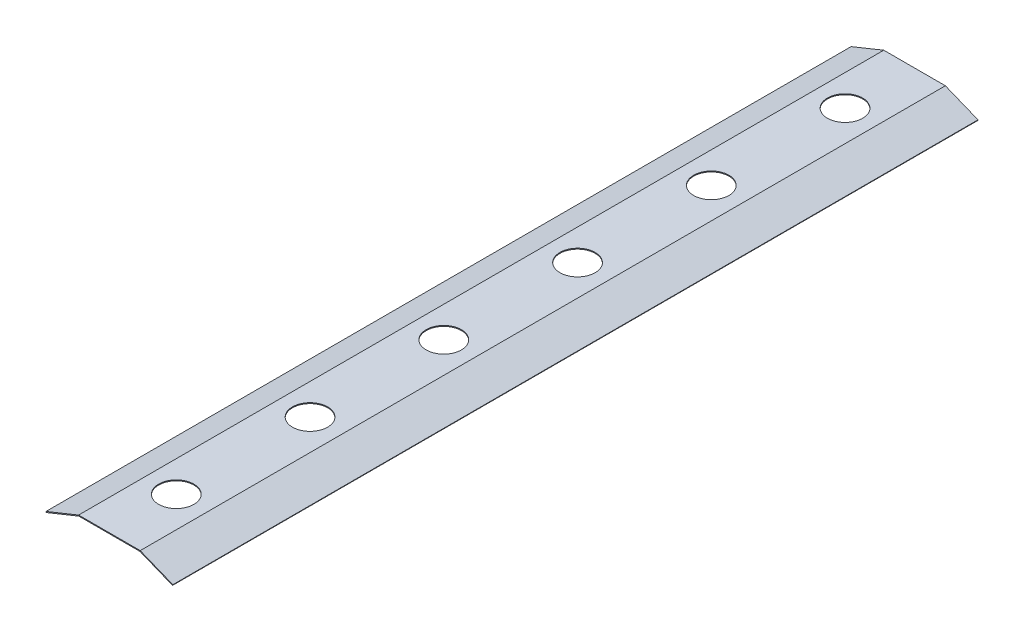
ISO-10303-21;
HEADER;
FILE_DESCRIPTION(('STEP AP214'),'2;1');
FILE_NAME('part.step','',(''),(''),'','','');
FILE_SCHEMA(('AUTOMOTIVE_DESIGN { 1 0 10303 214 1 1 1 1 }'));
ENDSEC;
DATA;
#1=APPLICATION_CONTEXT('core data for automotive mechanical design processes');
#2=APPLICATION_PROTOCOL_DEFINITION('international standard','automotive_design',2000,#1);
#3=PRODUCT_CONTEXT('',#1,'mechanical');
#4=PRODUCT('Part','Part','',(#3));
#5=PRODUCT_RELATED_PRODUCT_CATEGORY('part','',(#4));
#6=PRODUCT_DEFINITION_FORMATION('','',#4);
#7=PRODUCT_DEFINITION_CONTEXT('part definition',#1,'design');
#8=PRODUCT_DEFINITION('design','',#6,#7);
#9=PRODUCT_DEFINITION_SHAPE('','',#8);
#10=(LENGTH_UNIT() NAMED_UNIT(*) SI_UNIT(.MILLI.,.METRE.));
#11=(NAMED_UNIT(*) PLANE_ANGLE_UNIT() SI_UNIT($,.RADIAN.));
#12=(NAMED_UNIT(*) SI_UNIT($,.STERADIAN.) SOLID_ANGLE_UNIT());
#13=UNCERTAINTY_MEASURE_WITH_UNIT(LENGTH_MEASURE(1.E-05),#10,'distance_accuracy_value','');
#14=(GEOMETRIC_REPRESENTATION_CONTEXT(3) GLOBAL_UNCERTAINTY_ASSIGNED_CONTEXT((#13)) GLOBAL_UNIT_ASSIGNED_CONTEXT((#10,
#11,#12)) REPRESENTATION_CONTEXT('',''));
#15=CARTESIAN_POINT('',(0.,0.,0.));
#16=DIRECTION('',(0.,0.,1.));
#17=DIRECTION('',(1.,0.,0.));
#18=AXIS2_PLACEMENT_3D('',#15,#16,#17);
#19=CARTESIAN_POINT('',(-34.8056196908623,-1.,-915.));
#20=DIRECTION('',(0.,-1.,0.));
#21=DIRECTION('',(0.,0.,-1.));
#22=AXIS2_PLACEMENT_3D('',#19,#20,#21);
#23=PLANE('',#22);
#24=CARTESIAN_POINT('',(0.,-1.,-76.));
#25=DIRECTION('',(0.,-1.,0.));
#26=DIRECTION('',(0.,0.,-1.));
#27=AXIS2_PLACEMENT_3D('',#24,#25,#26);
#28=CIRCLE('',#27,20.);
#29=CARTESIAN_POINT('',(0.,-1.,-96.));
#30=VERTEX_POINT('',#29);
#31=EDGE_CURVE('E134',#30,#30,#28,.T.);
#32=ORIENTED_EDGE('',*,*,#31,.F.);
#33=EDGE_LOOP('',(#32));
#34=FACE_BOUND('',#33,.T.);
#35=CARTESIAN_POINT('',(0.,-1.,-228.));
#36=DIRECTION('',(0.,-1.,0.));
#37=DIRECTION('',(0.,0.,-1.));
#38=AXIS2_PLACEMENT_3D('',#35,#36,#37);
#39=CIRCLE('',#38,20.);
#40=CARTESIAN_POINT('',(0.,-1.,-248.));
#41=VERTEX_POINT('',#40);
#42=EDGE_CURVE('E256',#41,#41,#39,.T.);
#43=ORIENTED_EDGE('',*,*,#42,.F.);
#44=EDGE_LOOP('',(#43));
#45=FACE_BOUND('',#44,.T.);
#46=CARTESIAN_POINT('',(0.,-1.,-380.));
#47=DIRECTION('',(0.,-1.,0.));
#48=DIRECTION('',(0.,0.,-1.));
#49=AXIS2_PLACEMENT_3D('',#46,#47,#48);
#50=CIRCLE('',#49,20.);
#51=CARTESIAN_POINT('',(0.,-1.,-400.));
#52=VERTEX_POINT('',#51);
#53=EDGE_CURVE('E253',#52,#52,#50,.T.);
#54=ORIENTED_EDGE('',*,*,#53,.F.);
#55=EDGE_LOOP('',(#54));
#56=FACE_BOUND('',#55,.T.);
#57=CARTESIAN_POINT('',(0.,-1.,-532.));
#58=DIRECTION('',(0.,-1.,0.));
#59=DIRECTION('',(0.,0.,-1.));
#60=AXIS2_PLACEMENT_3D('',#57,#58,#59);
#61=CIRCLE('',#60,20.);
#62=CARTESIAN_POINT('',(0.,-1.,-552.));
#63=VERTEX_POINT('',#62);
#64=EDGE_CURVE('E250',#63,#63,#61,.T.);
#65=ORIENTED_EDGE('',*,*,#64,.F.);
#66=EDGE_LOOP('',(#65));
#67=FACE_BOUND('',#66,.T.);
#68=CARTESIAN_POINT('',(0.,-1.,-684.));
#69=DIRECTION('',(0.,-1.,0.));
#70=DIRECTION('',(0.,0.,-1.));
#71=AXIS2_PLACEMENT_3D('',#68,#69,#70);
#72=CIRCLE('',#71,20.);
#73=CARTESIAN_POINT('',(0.,-1.,-704.));
#74=VERTEX_POINT('',#73);
#75=EDGE_CURVE('E231',#74,#74,#72,.T.);
#76=ORIENTED_EDGE('',*,*,#75,.F.);
#77=EDGE_LOOP('',(#76));
#78=FACE_BOUND('',#77,.T.);
#79=CARTESIAN_POINT('',(0.,-1.,-836.));
#80=DIRECTION('',(0.,-1.,0.));
#81=DIRECTION('',(0.,0.,-1.));
#82=AXIS2_PLACEMENT_3D('',#79,#80,#81);
#83=CIRCLE('',#82,20.);
#84=CARTESIAN_POINT('',(0.,-1.,-856.));
#85=VERTEX_POINT('',#84);
#86=EDGE_CURVE('E227',#85,#85,#83,.T.);
#87=ORIENTED_EDGE('',*,*,#86,.F.);
#88=EDGE_LOOP('',(#87));
#89=FACE_BOUND('',#88,.T.);
#90=DIRECTION('',(1.,0.,0.));
#91=VECTOR('',#90,1.);
#92=CARTESIAN_POINT('',(-34.8056196908623,-1.,0.));
#93=LINE('',#92,#91);
#94=CARTESIAN_POINT('',(-34.8056196908623,-1.,0.));
#95=VERTEX_POINT('',#94);
#96=CARTESIAN_POINT('',(34.8056196908623,-1.,0.));
#97=VERTEX_POINT('',#96);
#98=EDGE_CURVE('E130',#95,#97,#93,.T.);
#99=ORIENTED_EDGE('',*,*,#98,.F.);
#100=DIRECTION('',(0.,0.,1.));
#101=VECTOR('',#100,1.);
#102=CARTESIAN_POINT('',(-34.8056196908623,-1.,-915.));
#103=LINE('',#102,#101);
#104=CARTESIAN_POINT('',(-34.8056196908623,-1.,-915.));
#105=VERTEX_POINT('',#104);
#106=EDGE_CURVE('E11',#105,#95,#103,.T.);
#107=ORIENTED_EDGE('',*,*,#106,.F.);
#108=DIRECTION('',(1.,0.,0.));
#109=VECTOR('',#108,1.);
#110=CARTESIAN_POINT('',(-34.8056196908623,-1.,-915.));
#111=LINE('',#110,#109);
#112=CARTESIAN_POINT('',(34.8056196908623,-1.,-915.));
#113=VERTEX_POINT('',#112);
#114=EDGE_CURVE('E151',#105,#113,#111,.T.);
#115=ORIENTED_EDGE('',*,*,#114,.T.);
#116=DIRECTION('',(0.,0.,1.));
#117=VECTOR('',#116,1.);
#118=CARTESIAN_POINT('',(34.8056196908623,-1.,-915.));
#119=LINE('',#118,#117);
#120=EDGE_CURVE('E36',#113,#97,#119,.T.);
#121=ORIENTED_EDGE('',*,*,#120,.T.);
#122=EDGE_LOOP('',(#99,#107,#115,#121));
#123=FACE_BOUND('',#122,.T.);
#124=ADVANCED_FACE('F33',(#34,#45,#56,#67,#78,#89,#123),#23,.T.);
#125=CARTESIAN_POINT('',(-34.8056196908623,-1.,-915.));
#126=DIRECTION('',(0.374606593415907,-0.92718385456679,0.));
#127=DIRECTION('',(0.92718385456679,0.374606593415907,0.));
#128=AXIS2_PLACEMENT_3D('',#125,#126,#127);
#129=PLANE('',#128);
#130=DIRECTION('',(0.92718385456679,0.374606593415907,0.));
#131=VECTOR('',#130,1.);
#132=CARTESIAN_POINT('',(-34.8056196908623,-1.,0.));
#133=LINE('',#132,#131);
#134=CARTESIAN_POINT('',(-71.7127475892557,-15.9114475912031,0.));
#135=VERTEX_POINT('',#134);
#136=EDGE_CURVE('E149',#135,#95,#133,.T.);
#137=ORIENTED_EDGE('',*,*,#136,.F.);
#138=DIRECTION('',(0.,0.,1.));
#139=VECTOR('',#138,1.);
#140=CARTESIAN_POINT('',(-71.7127475892557,-15.9114475912031,-915.));
#141=LINE('',#140,#139);
#142=CARTESIAN_POINT('',(-71.7127475892557,-15.9114475912031,-915.));
#143=VERTEX_POINT('',#142);
#144=EDGE_CURVE('E42',#143,#135,#141,.T.);
#145=ORIENTED_EDGE('',*,*,#144,.F.);
#146=DIRECTION('',(0.92718385456679,0.374606593415907,0.));
#147=VECTOR('',#146,1.);
#148=CARTESIAN_POINT('',(-34.8056196908623,-1.,-915.));
#149=LINE('',#148,#147);
#150=EDGE_CURVE('E120',#143,#105,#149,.T.);
#151=ORIENTED_EDGE('',*,*,#150,.T.);
#152=ORIENTED_EDGE('',*,*,#106,.T.);
#153=EDGE_LOOP('',(#137,#145,#151,#152));
#154=FACE_BOUND('',#153,.T.);
#155=ADVANCED_FACE('F163',(#154),#129,.T.);
#156=CARTESIAN_POINT('',(-72.0873541826716,-14.9842637366363,-915.));
#157=DIRECTION('',(-0.927183854566788,-0.374606593415911,0.));
#158=DIRECTION('',(0.374606593415911,-0.927183854566788,0.));
#159=AXIS2_PLACEMENT_3D('',#156,#157,#158);
#160=PLANE('',#159);
#161=DIRECTION('',(0.374606593415911,-0.927183854566788,0.));
#162=VECTOR('',#161,1.);
#163=CARTESIAN_POINT('',(-72.0873541826716,-14.9842637366363,0.));
#164=LINE('',#163,#162);
#165=CARTESIAN_POINT('',(-72.0873541826716,-14.9842637366363,0.));
#166=VERTEX_POINT('',#165);
#167=EDGE_CURVE('E107',#166,#135,#164,.T.);
#168=ORIENTED_EDGE('',*,*,#167,.F.);
#169=DIRECTION('',(0.,0.,1.));
#170=VECTOR('',#169,1.);
#171=CARTESIAN_POINT('',(-72.0873541826716,-14.9842637366363,-915.));
#172=LINE('',#171,#170);
#173=CARTESIAN_POINT('',(-72.0873541826716,-14.9842637366363,-915.));
#174=VERTEX_POINT('',#173);
#175=EDGE_CURVE('E102',#174,#166,#172,.T.);
#176=ORIENTED_EDGE('',*,*,#175,.F.);
#177=DIRECTION('',(0.374606593415911,-0.927183854566788,0.));
#178=VECTOR('',#177,1.);
#179=CARTESIAN_POINT('',(-72.0873541826716,-14.9842637366363,-915.));
#180=LINE('',#179,#178);
#181=EDGE_CURVE('E105',#174,#143,#180,.T.);
#182=ORIENTED_EDGE('',*,*,#181,.T.);
#183=ORIENTED_EDGE('',*,*,#144,.T.);
#184=EDGE_LOOP('',(#168,#176,#182,#183));
#185=FACE_BOUND('',#184,.T.);
#186=ADVANCED_FACE('F104',(#185),#160,.T.);
#187=CARTESIAN_POINT('',(-35.,0.,-915.));
#188=DIRECTION('',(-0.374606593415907,0.92718385456679,0.));
#189=DIRECTION('',(-0.92718385456679,-0.374606593415907,0.));
#190=AXIS2_PLACEMENT_3D('',#187,#188,#189);
#191=PLANE('',#190);
#192=DIRECTION('',(-0.92718385456679,-0.374606593415907,0.));
#193=VECTOR('',#192,1.);
#194=CARTESIAN_POINT('',(-35.,0.,0.));
#195=LINE('',#194,#193);
#196=CARTESIAN_POINT('',(-35.,0.,0.));
#197=VERTEX_POINT('',#196);
#198=EDGE_CURVE('E146',#197,#166,#195,.T.);
#199=ORIENTED_EDGE('',*,*,#198,.F.);
#200=DIRECTION('',(0.,0.,1.));
#201=VECTOR('',#200,1.);
#202=CARTESIAN_POINT('',(-35.,0.,-915.));
#203=LINE('',#202,#201);
#204=CARTESIAN_POINT('',(-35.,0.,-915.));
#205=VERTEX_POINT('',#204);
#206=EDGE_CURVE('E112',#205,#197,#203,.T.);
#207=ORIENTED_EDGE('',*,*,#206,.F.);
#208=DIRECTION('',(-0.92718385456679,-0.374606593415907,0.));
#209=VECTOR('',#208,1.);
#210=CARTESIAN_POINT('',(-35.,0.,-915.));
#211=LINE('',#210,#209);
#212=EDGE_CURVE('E118',#205,#174,#211,.T.);
#213=ORIENTED_EDGE('',*,*,#212,.T.);
#214=ORIENTED_EDGE('',*,*,#175,.T.);
#215=EDGE_LOOP('',(#199,#207,#213,#214));
#216=FACE_BOUND('',#215,.T.);
#217=ADVANCED_FACE('F122',(#216),#191,.T.);
#218=CARTESIAN_POINT('',(-35.,0.,-915.));
#219=DIRECTION('',(0.,1.,0.));
#220=DIRECTION('',(-1.,0.,0.));
#221=AXIS2_PLACEMENT_3D('',#218,#219,#220);
#222=PLANE('',#221);
#223=CARTESIAN_POINT('',(0.,0.,-76.));
#224=DIRECTION('',(0.,1.,0.));
#225=DIRECTION('',(-1.,0.,0.));
#226=AXIS2_PLACEMENT_3D('',#223,#224,#225);
#227=CIRCLE('',#226,20.);
#228=CARTESIAN_POINT('',(-20.,0.,-76.));
#229=VERTEX_POINT('',#228);
#230=EDGE_CURVE('E226',#229,#229,#227,.T.);
#231=ORIENTED_EDGE('',*,*,#230,.F.);
#232=EDGE_LOOP('',(#231));
#233=FACE_BOUND('',#232,.T.);
#234=CARTESIAN_POINT('',(0.,0.,-228.));
#235=DIRECTION('',(0.,1.,0.));
#236=DIRECTION('',(-1.,0.,0.));
#237=AXIS2_PLACEMENT_3D('',#234,#235,#236);
#238=CIRCLE('',#237,20.);
#239=CARTESIAN_POINT('',(-20.,0.,-228.));
#240=VERTEX_POINT('',#239);
#241=EDGE_CURVE('E228',#240,#240,#238,.T.);
#242=ORIENTED_EDGE('',*,*,#241,.F.);
#243=EDGE_LOOP('',(#242));
#244=FACE_BOUND('',#243,.T.);
#245=CARTESIAN_POINT('',(0.,0.,-380.));
#246=DIRECTION('',(0.,1.,0.));
#247=DIRECTION('',(-1.,0.,0.));
#248=AXIS2_PLACEMENT_3D('',#245,#246,#247);
#249=CIRCLE('',#248,20.);
#250=CARTESIAN_POINT('',(-20.,0.,-380.));
#251=VERTEX_POINT('',#250);
#252=EDGE_CURVE('E234',#251,#251,#249,.T.);
#253=ORIENTED_EDGE('',*,*,#252,.F.);
#254=EDGE_LOOP('',(#253));
#255=FACE_BOUND('',#254,.T.);
#256=CARTESIAN_POINT('',(0.,0.,-532.));
#257=DIRECTION('',(0.,1.,0.));
#258=DIRECTION('',(-1.,0.,0.));
#259=AXIS2_PLACEMENT_3D('',#256,#257,#258);
#260=CIRCLE('',#259,20.);
#261=CARTESIAN_POINT('',(-20.,0.,-532.));
#262=VERTEX_POINT('',#261);
#263=EDGE_CURVE('E239',#262,#262,#260,.T.);
#264=ORIENTED_EDGE('',*,*,#263,.F.);
#265=EDGE_LOOP('',(#264));
#266=FACE_BOUND('',#265,.T.);
#267=CARTESIAN_POINT('',(0.,0.,-684.));
#268=DIRECTION('',(0.,1.,0.));
#269=DIRECTION('',(-1.,0.,0.));
#270=AXIS2_PLACEMENT_3D('',#267,#268,#269);
#271=CIRCLE('',#270,20.);
#272=CARTESIAN_POINT('',(-20.,0.,-684.));
#273=VERTEX_POINT('',#272);
#274=EDGE_CURVE('E242',#273,#273,#271,.T.);
#275=ORIENTED_EDGE('',*,*,#274,.F.);
#276=EDGE_LOOP('',(#275));
#277=FACE_BOUND('',#276,.T.);
#278=CARTESIAN_POINT('',(0.,0.,-836.));
#279=DIRECTION('',(0.,1.,0.));
#280=DIRECTION('',(-1.,0.,0.));
#281=AXIS2_PLACEMENT_3D('',#278,#279,#280);
#282=CIRCLE('',#281,20.);
#283=CARTESIAN_POINT('',(-20.,0.,-836.));
#284=VERTEX_POINT('',#283);
#285=EDGE_CURVE('E245',#284,#284,#282,.T.);
#286=ORIENTED_EDGE('',*,*,#285,.F.);
#287=EDGE_LOOP('',(#286));
#288=FACE_BOUND('',#287,.T.);
#289=DIRECTION('',(-1.,0.,0.));
#290=VECTOR('',#289,1.);
#291=CARTESIAN_POINT('',(-35.,0.,0.));
#292=LINE('',#291,#290);
#293=CARTESIAN_POINT('',(35.,0.,0.));
#294=VERTEX_POINT('',#293);
#295=EDGE_CURVE('E143',#294,#197,#292,.T.);
#296=ORIENTED_EDGE('',*,*,#295,.F.);
#297=DIRECTION('',(0.,0.,1.));
#298=VECTOR('',#297,1.);
#299=CARTESIAN_POINT('',(35.,0.,-915.));
#300=LINE('',#299,#298);
#301=CARTESIAN_POINT('',(35.,0.,-915.));
#302=VERTEX_POINT('',#301);
#303=EDGE_CURVE('E155',#302,#294,#300,.T.);
#304=ORIENTED_EDGE('',*,*,#303,.F.);
#305=DIRECTION('',(-1.,0.,0.));
#306=VECTOR('',#305,1.);
#307=CARTESIAN_POINT('',(-35.,0.,-915.));
#308=LINE('',#307,#306);
#309=EDGE_CURVE('E123',#302,#205,#308,.T.);
#310=ORIENTED_EDGE('',*,*,#309,.T.);
#311=ORIENTED_EDGE('',*,*,#206,.T.);
#312=EDGE_LOOP('',(#296,#304,#310,#311));
#313=FACE_BOUND('',#312,.T.);
#314=ADVANCED_FACE('F177',(#233,#244,#255,#266,#277,#288,#313),#222,.T.);
#315=CARTESIAN_POINT('',(35.,0.,-915.));
#316=DIRECTION('',(0.374606593415913,0.927183854566787,0.));
#317=DIRECTION('',(-0.927183854566787,0.374606593415913,0.));
#318=AXIS2_PLACEMENT_3D('',#315,#316,#317);
#319=PLANE('',#318);
#320=DIRECTION('',(-0.927183854566787,0.374606593415913,0.));
#321=VECTOR('',#320,1.);
#322=CARTESIAN_POINT('',(35.,0.,0.));
#323=LINE('',#322,#321);
#324=CARTESIAN_POINT('',(72.0873541826715,-14.9842637366365,0.));
#325=VERTEX_POINT('',#324);
#326=EDGE_CURVE('E140',#325,#294,#323,.T.);
#327=ORIENTED_EDGE('',*,*,#326,.F.);
#328=DIRECTION('',(0.,0.,1.));
#329=VECTOR('',#328,1.);
#330=CARTESIAN_POINT('',(72.0873541826715,-14.9842637366365,-915.));
#331=LINE('',#330,#329);
#332=CARTESIAN_POINT('',(72.0873541826715,-14.9842637366365,-915.));
#333=VERTEX_POINT('',#332);
#334=EDGE_CURVE('E157',#333,#325,#331,.T.);
#335=ORIENTED_EDGE('',*,*,#334,.F.);
#336=DIRECTION('',(-0.927183854566787,0.374606593415913,0.));
#337=VECTOR('',#336,1.);
#338=CARTESIAN_POINT('',(35.,0.,-915.));
#339=LINE('',#338,#337);
#340=EDGE_CURVE('E125',#333,#302,#339,.T.);
#341=ORIENTED_EDGE('',*,*,#340,.T.);
#342=ORIENTED_EDGE('',*,*,#303,.T.);
#343=EDGE_LOOP('',(#327,#335,#341,#342));
#344=FACE_BOUND('',#343,.T.);
#345=ADVANCED_FACE('F180',(#344),#319,.T.);
#346=CARTESIAN_POINT('',(72.0873541826715,-14.9842637366365,-915.));
#347=DIRECTION('',(0.927183854566788,-0.374606593415911,0.));
#348=DIRECTION('',(0.374606593415911,0.927183854566788,0.));
#349=AXIS2_PLACEMENT_3D('',#346,#347,#348);
#350=PLANE('',#349);
#351=DIRECTION('',(0.374606593415911,0.927183854566788,0.));
#352=VECTOR('',#351,1.);
#353=CARTESIAN_POINT('',(72.0873541826715,-14.9842637366365,0.));
#354=LINE('',#353,#352);
#355=CARTESIAN_POINT('',(71.7127475892556,-15.9114475912033,0.));
#356=VERTEX_POINT('',#355);
#357=EDGE_CURVE('E137',#356,#325,#354,.T.);
#358=ORIENTED_EDGE('',*,*,#357,.F.);
#359=DIRECTION('',(0.,0.,1.));
#360=VECTOR('',#359,1.);
#361=CARTESIAN_POINT('',(71.7127475892556,-15.9114475912033,-915.));
#362=LINE('',#361,#360);
#363=CARTESIAN_POINT('',(71.7127475892556,-15.9114475912033,-915.));
#364=VERTEX_POINT('',#363);
#365=EDGE_CURVE('E158',#364,#356,#362,.T.);
#366=ORIENTED_EDGE('',*,*,#365,.F.);
#367=DIRECTION('',(0.374606593415911,0.927183854566788,0.));
#368=VECTOR('',#367,1.);
#369=CARTESIAN_POINT('',(72.0873541826715,-14.9842637366365,-915.));
#370=LINE('',#369,#368);
#371=EDGE_CURVE('E263',#364,#333,#370,.T.);
#372=ORIENTED_EDGE('',*,*,#371,.T.);
#373=ORIENTED_EDGE('',*,*,#334,.T.);
#374=EDGE_LOOP('',(#358,#366,#372,#373));
#375=FACE_BOUND('',#374,.T.);
#376=ADVANCED_FACE('F184',(#375),#350,.T.);
#377=CARTESIAN_POINT('',(34.8056196908623,-1.,-915.));
#378=DIRECTION('',(-0.374606593415913,-0.927183854566787,0.));
#379=DIRECTION('',(0.927183854566787,-0.374606593415913,0.));
#380=AXIS2_PLACEMENT_3D('',#377,#378,#379);
#381=PLANE('',#380);
#382=DIRECTION('',(0.927183854566787,-0.374606593415913,0.));
#383=VECTOR('',#382,1.);
#384=CARTESIAN_POINT('',(34.8056196908623,-1.,0.));
#385=LINE('',#384,#383);
#386=EDGE_CURVE('E133',#97,#356,#385,.T.);
#387=ORIENTED_EDGE('',*,*,#386,.F.);
#388=ORIENTED_EDGE('',*,*,#120,.F.);
#389=DIRECTION('',(0.927183854566787,-0.374606593415913,0.));
#390=VECTOR('',#389,1.);
#391=CARTESIAN_POINT('',(34.8056196908623,-1.,-915.));
#392=LINE('',#391,#390);
#393=EDGE_CURVE('E261',#113,#364,#392,.T.);
#394=ORIENTED_EDGE('',*,*,#393,.T.);
#395=ORIENTED_EDGE('',*,*,#365,.T.);
#396=EDGE_LOOP('',(#387,#388,#394,#395));
#397=FACE_BOUND('',#396,.T.);
#398=ADVANCED_FACE('F160',(#397),#381,.T.);
#399=CARTESIAN_POINT('',(0.,0.,-915.));
#400=DIRECTION('',(0.,0.,-1.));
#401=DIRECTION('',(-1.,0.,0.));
#402=AXIS2_PLACEMENT_3D('',#399,#400,#401);
#403=PLANE('',#402);
#404=ORIENTED_EDGE('',*,*,#114,.F.);
#405=ORIENTED_EDGE('',*,*,#150,.F.);
#406=ORIENTED_EDGE('',*,*,#181,.F.);
#407=ORIENTED_EDGE('',*,*,#212,.F.);
#408=ORIENTED_EDGE('',*,*,#309,.F.);
#409=ORIENTED_EDGE('',*,*,#340,.F.);
#410=ORIENTED_EDGE('',*,*,#371,.F.);
#411=ORIENTED_EDGE('',*,*,#393,.F.);
#412=EDGE_LOOP('',(#404,#405,#406,#407,#408,#409,#410,#411));
#413=FACE_BOUND('',#412,.T.);
#414=ADVANCED_FACE('F116',(#413),#403,.T.);
#415=CARTESIAN_POINT('',(0.,0.,0.));
#416=DIRECTION('',(0.,0.,-1.));
#417=DIRECTION('',(-1.,0.,0.));
#418=AXIS2_PLACEMENT_3D('',#415,#416,#417);
#419=PLANE('',#418);
#420=ORIENTED_EDGE('',*,*,#98,.T.);
#421=ORIENTED_EDGE('',*,*,#386,.T.);
#422=ORIENTED_EDGE('',*,*,#357,.T.);
#423=ORIENTED_EDGE('',*,*,#326,.T.);
#424=ORIENTED_EDGE('',*,*,#295,.T.);
#425=ORIENTED_EDGE('',*,*,#198,.T.);
#426=ORIENTED_EDGE('',*,*,#167,.T.);
#427=ORIENTED_EDGE('',*,*,#136,.T.);
#428=EDGE_LOOP('',(#420,#421,#422,#423,#424,#425,#426,#427));
#429=FACE_BOUND('',#428,.T.);
#430=ADVANCED_FACE('F162',(#429),#419,.F.);
#431=CARTESIAN_POINT('',(1.83697019872103E-13,-1000.,-836.));
#432=DIRECTION('',(0.,1.,0.));
#433=DIRECTION('',(-1.,0.,0.));
#434=AXIS2_PLACEMENT_3D('',#431,#432,#433);
#435=CYLINDRICAL_SURFACE('',#434,20.);
#436=ORIENTED_EDGE('',*,*,#86,.T.);
#437=EDGE_LOOP('',(#436));
#438=FACE_BOUND('',#437,.T.);
#439=ORIENTED_EDGE('',*,*,#285,.T.);
#440=EDGE_LOOP('',(#439));
#441=FACE_BOUND('',#440,.T.);
#442=ADVANCED_FACE('F195',(#438,#441),#435,.F.);
#443=CARTESIAN_POINT('',(1.83697019872103E-13,-1000.,-684.));
#444=DIRECTION('',(0.,1.,0.));
#445=DIRECTION('',(-1.,0.,0.));
#446=AXIS2_PLACEMENT_3D('',#443,#444,#445);
#447=CYLINDRICAL_SURFACE('',#446,20.);
#448=ORIENTED_EDGE('',*,*,#75,.T.);
#449=EDGE_LOOP('',(#448));
#450=FACE_BOUND('',#449,.T.);
#451=ORIENTED_EDGE('',*,*,#274,.T.);
#452=EDGE_LOOP('',(#451));
#453=FACE_BOUND('',#452,.T.);
#454=ADVANCED_FACE('F199',(#450,#453),#447,.F.);
#455=CARTESIAN_POINT('',(1.83697019872103E-13,-1000.,-532.));
#456=DIRECTION('',(0.,1.,0.));
#457=DIRECTION('',(-1.,0.,0.));
#458=AXIS2_PLACEMENT_3D('',#455,#456,#457);
#459=CYLINDRICAL_SURFACE('',#458,20.);
#460=ORIENTED_EDGE('',*,*,#64,.T.);
#461=EDGE_LOOP('',(#460));
#462=FACE_BOUND('',#461,.T.);
#463=ORIENTED_EDGE('',*,*,#263,.T.);
#464=EDGE_LOOP('',(#463));
#465=FACE_BOUND('',#464,.T.);
#466=ADVANCED_FACE('F203',(#462,#465),#459,.F.);
#467=CARTESIAN_POINT('',(1.83697019872103E-13,-1000.,-380.));
#468=DIRECTION('',(0.,1.,0.));
#469=DIRECTION('',(-1.,0.,0.));
#470=AXIS2_PLACEMENT_3D('',#467,#468,#469);
#471=CYLINDRICAL_SURFACE('',#470,20.);
#472=ORIENTED_EDGE('',*,*,#53,.T.);
#473=EDGE_LOOP('',(#472));
#474=FACE_BOUND('',#473,.T.);
#475=ORIENTED_EDGE('',*,*,#252,.T.);
#476=EDGE_LOOP('',(#475));
#477=FACE_BOUND('',#476,.T.);
#478=ADVANCED_FACE('F207',(#474,#477),#471,.F.);
#479=CARTESIAN_POINT('',(1.83697019872103E-13,-1000.,-228.));
#480=DIRECTION('',(0.,1.,0.));
#481=DIRECTION('',(-1.,0.,0.));
#482=AXIS2_PLACEMENT_3D('',#479,#480,#481);
#483=CYLINDRICAL_SURFACE('',#482,20.);
#484=ORIENTED_EDGE('',*,*,#42,.T.);
#485=EDGE_LOOP('',(#484));
#486=FACE_BOUND('',#485,.T.);
#487=ORIENTED_EDGE('',*,*,#241,.T.);
#488=EDGE_LOOP('',(#487));
#489=FACE_BOUND('',#488,.T.);
#490=ADVANCED_FACE('F211',(#486,#489),#483,.F.);
#491=CARTESIAN_POINT('',(1.83697019872103E-13,-1000.,-76.));
#492=DIRECTION('',(0.,1.,0.));
#493=DIRECTION('',(-1.,0.,0.));
#494=AXIS2_PLACEMENT_3D('',#491,#492,#493);
#495=CYLINDRICAL_SURFACE('',#494,20.);
#496=ORIENTED_EDGE('',*,*,#31,.T.);
#497=EDGE_LOOP('',(#496));
#498=FACE_BOUND('',#497,.T.);
#499=ORIENTED_EDGE('',*,*,#230,.T.);
#500=EDGE_LOOP('',(#499));
#501=FACE_BOUND('',#500,.T.);
#502=ADVANCED_FACE('F215',(#498,#501),#495,.F.);
#503=CLOSED_SHELL('',(#124,#155,#186,#217,#314,#345,#376,#398,#414,#430,#442,#454,#466,#478,
#490,#502));
#504=MANIFOLD_SOLID_BREP('B2',#503);
#505=ADVANCED_BREP_SHAPE_REPRESENTATION('',(#18,#504),#14);
#506=SHAPE_DEFINITION_REPRESENTATION(#9,#505);
ENDSEC;
END-ISO-10303-21;
